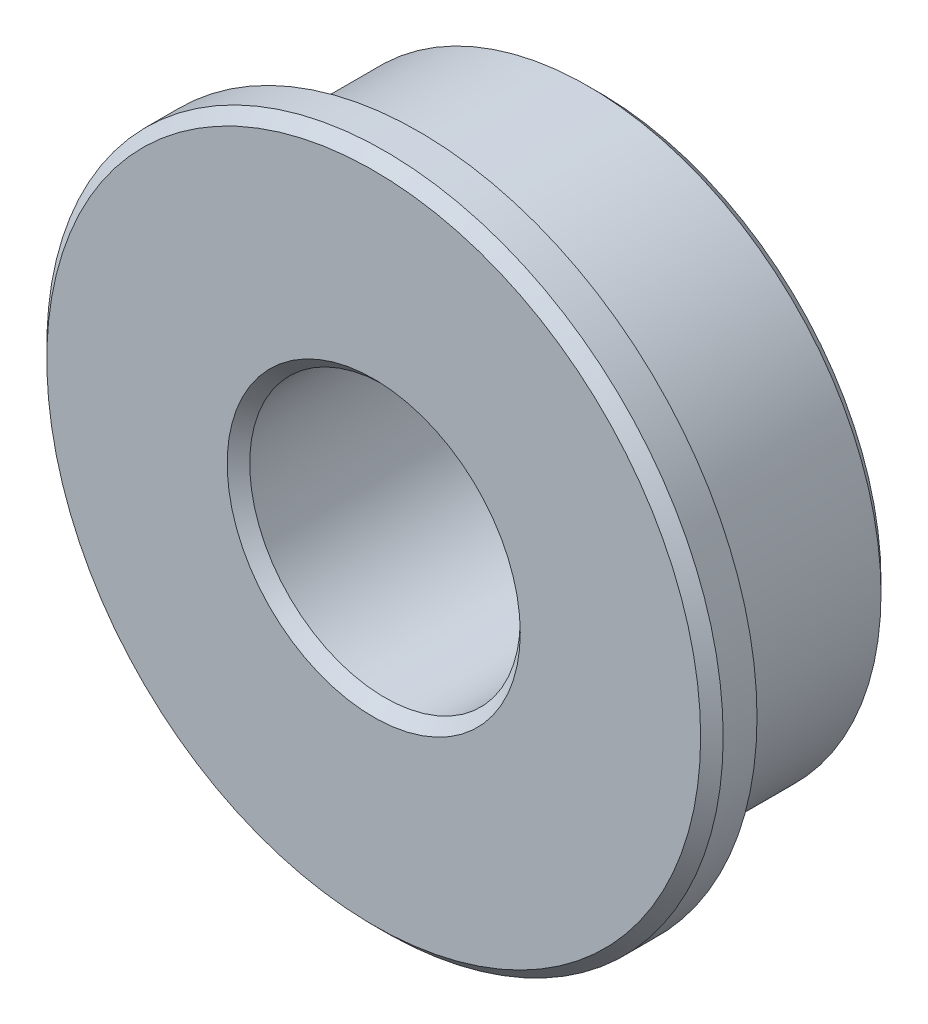
ISO-10303-21;
HEADER;
FILE_DESCRIPTION(('STEP AP214'),'2;1');
FILE_NAME('part.step','',(''),(''),'','','');
FILE_SCHEMA(('AUTOMOTIVE_DESIGN { 1 0 10303 214 1 1 1 1 }'));
ENDSEC;
DATA;
#1=APPLICATION_CONTEXT('core data for automotive mechanical design processes');
#2=APPLICATION_PROTOCOL_DEFINITION('international standard','automotive_design',2000,#1);
#3=PRODUCT_CONTEXT('',#1,'mechanical');
#4=PRODUCT('Part','Part','',(#3));
#5=PRODUCT_RELATED_PRODUCT_CATEGORY('part','',(#4));
#6=PRODUCT_DEFINITION_FORMATION('','',#4);
#7=PRODUCT_DEFINITION_CONTEXT('part definition',#1,'design');
#8=PRODUCT_DEFINITION('design','',#6,#7);
#9=PRODUCT_DEFINITION_SHAPE('','',#8);
#10=(LENGTH_UNIT() NAMED_UNIT(*) SI_UNIT(.MILLI.,.METRE.));
#11=(NAMED_UNIT(*) PLANE_ANGLE_UNIT() SI_UNIT($,.RADIAN.));
#12=(NAMED_UNIT(*) SI_UNIT($,.STERADIAN.) SOLID_ANGLE_UNIT());
#13=UNCERTAINTY_MEASURE_WITH_UNIT(LENGTH_MEASURE(1.E-05),#10,'distance_accuracy_value','');
#14=(GEOMETRIC_REPRESENTATION_CONTEXT(3) GLOBAL_UNCERTAINTY_ASSIGNED_CONTEXT((#13)) GLOBAL_UNIT_ASSIGNED_CONTEXT((#10,
#11,#12)) REPRESENTATION_CONTEXT('',''));
#15=CARTESIAN_POINT('',(0.,0.,0.));
#16=DIRECTION('',(0.,0.,1.));
#17=DIRECTION('',(1.,0.,0.));
#18=AXIS2_PLACEMENT_3D('',#15,#16,#17);
#19=CARTESIAN_POINT('',(0.,0.,5.));
#20=DIRECTION('',(0.,0.,-1.));
#21=DIRECTION('',(-1.,0.,0.));
#22=AXIS2_PLACEMENT_3D('',#19,#20,#21);
#23=CYLINDRICAL_SURFACE('',#22,6.5);
#24=CARTESIAN_POINT('',(0.,0.,0.250000000000003));
#25=DIRECTION('',(0.,0.,1.));
#26=DIRECTION('',(1.,0.,0.));
#27=AXIS2_PLACEMENT_3D('',#24,#25,#26);
#28=CIRCLE('',#27,6.5);
#29=CARTESIAN_POINT('',(6.5,0.,0.250000000000003));
#30=VERTEX_POINT('',#29);
#31=EDGE_CURVE('E38',#30,#30,#28,.T.);
#32=ORIENTED_EDGE('',*,*,#31,.T.);
#33=EDGE_LOOP('',(#32));
#34=FACE_BOUND('',#33,.T.);
#35=CARTESIAN_POINT('',(0.,0.,4.));
#36=DIRECTION('',(0.,0.,1.));
#37=DIRECTION('',(1.,0.,0.));
#38=AXIS2_PLACEMENT_3D('',#35,#36,#37);
#39=CIRCLE('',#38,6.5);
#40=CARTESIAN_POINT('',(6.5,0.,4.));
#41=VERTEX_POINT('',#40);
#42=EDGE_CURVE('E57',#41,#41,#39,.T.);
#43=ORIENTED_EDGE('',*,*,#42,.F.);
#44=EDGE_LOOP('',(#43));
#45=FACE_BOUND('',#44,.T.);
#46=ADVANCED_FACE('F31',(#34,#45),#23,.T.);
#47=CARTESIAN_POINT('',(0.,0.,5.));
#48=DIRECTION('',(0.,0.,1.));
#49=DIRECTION('',(1.,0.,0.));
#50=AXIS2_PLACEMENT_3D('',#47,#48,#49);
#51=PLANE('',#50);
#52=CARTESIAN_POINT('',(0.,0.,5.));
#53=DIRECTION('',(0.,0.,1.));
#54=DIRECTION('',(1.,0.,0.));
#55=AXIS2_PLACEMENT_3D('',#52,#53,#54);
#56=CIRCLE('',#55,7.25);
#57=CARTESIAN_POINT('',(7.25,0.,5.));
#58=VERTEX_POINT('',#57);
#59=EDGE_CURVE('E51',#58,#58,#56,.T.);
#60=ORIENTED_EDGE('',*,*,#59,.T.);
#61=EDGE_LOOP('',(#60));
#62=FACE_BOUND('',#61,.T.);
#63=CARTESIAN_POINT('',(0.,0.,5.));
#64=DIRECTION('',(0.,0.,1.));
#65=DIRECTION('',(1.,0.,0.));
#66=AXIS2_PLACEMENT_3D('',#63,#64,#65);
#67=CIRCLE('',#66,3.25);
#68=CARTESIAN_POINT('',(3.25,0.,5.));
#69=VERTEX_POINT('',#68);
#70=EDGE_CURVE('E54',#69,#69,#67,.F.);
#71=ORIENTED_EDGE('',*,*,#70,.T.);
#72=EDGE_LOOP('',(#71));
#73=FACE_BOUND('',#72,.T.);
#74=ADVANCED_FACE('F77',(#62,#73),#51,.T.);
#75=CARTESIAN_POINT('',(0.,0.,0.));
#76=DIRECTION('',(0.,0.,1.));
#77=DIRECTION('',(1.,0.,0.));
#78=AXIS2_PLACEMENT_3D('',#75,#76,#77);
#79=PLANE('',#78);
#80=CARTESIAN_POINT('',(0.,0.,0.));
#81=DIRECTION('',(0.,0.,1.));
#82=DIRECTION('',(1.,0.,0.));
#83=AXIS2_PLACEMENT_3D('',#80,#81,#82);
#84=CIRCLE('',#83,6.25);
#85=CARTESIAN_POINT('',(6.25,0.,0.));
#86=VERTEX_POINT('',#85);
#87=EDGE_CURVE('E10',#86,#86,#84,.F.);
#88=ORIENTED_EDGE('',*,*,#87,.T.);
#89=EDGE_LOOP('',(#88));
#90=FACE_BOUND('',#89,.T.);
#91=CARTESIAN_POINT('',(0.,0.,0.));
#92=DIRECTION('',(0.,0.,1.));
#93=DIRECTION('',(1.,0.,0.));
#94=AXIS2_PLACEMENT_3D('',#91,#92,#93);
#95=CIRCLE('',#94,3.);
#96=CARTESIAN_POINT('',(3.,0.,0.));
#97=VERTEX_POINT('',#96);
#98=EDGE_CURVE('E58',#97,#97,#95,.T.);
#99=ORIENTED_EDGE('',*,*,#98,.T.);
#100=EDGE_LOOP('',(#99));
#101=FACE_BOUND('',#100,.T.);
#102=ADVANCED_FACE('F83',(#90,#101),#79,.F.);
#103=CARTESIAN_POINT('',(0.,0.,5.));
#104=DIRECTION('',(0.,0.,-1.));
#105=DIRECTION('',(-1.,0.,0.));
#106=AXIS2_PLACEMENT_3D('',#103,#104,#105);
#107=CYLINDRICAL_SURFACE('',#106,3.);
#108=CARTESIAN_POINT('',(0.,0.,4.75));
#109=DIRECTION('',(0.,0.,1.));
#110=DIRECTION('',(1.,0.,0.));
#111=AXIS2_PLACEMENT_3D('',#108,#109,#110);
#112=CIRCLE('',#111,3.);
#113=CARTESIAN_POINT('',(3.,0.,4.75));
#114=VERTEX_POINT('',#113);
#115=EDGE_CURVE('E42',#114,#114,#112,.T.);
#116=ORIENTED_EDGE('',*,*,#115,.T.);
#117=EDGE_LOOP('',(#116));
#118=FACE_BOUND('',#117,.T.);
#119=ORIENTED_EDGE('',*,*,#98,.F.);
#120=EDGE_LOOP('',(#119));
#121=FACE_BOUND('',#120,.T.);
#122=ADVANCED_FACE('F72',(#118,#121),#107,.F.);
#123=CARTESIAN_POINT('',(0.,0.,4.));
#124=DIRECTION('',(0.,0.,1.));
#125=DIRECTION('',(1.,0.,0.));
#126=AXIS2_PLACEMENT_3D('',#123,#124,#125);
#127=PLANE('',#126);
#128=CARTESIAN_POINT('',(0.,0.,4.));
#129=DIRECTION('',(0.,0.,1.));
#130=DIRECTION('',(1.,0.,0.));
#131=AXIS2_PLACEMENT_3D('',#128,#129,#130);
#132=CIRCLE('',#131,7.5);
#133=CARTESIAN_POINT('',(7.5,0.,4.));
#134=VERTEX_POINT('',#133);
#135=EDGE_CURVE('E61',#134,#134,#132,.T.);
#136=ORIENTED_EDGE('',*,*,#135,.F.);
#137=EDGE_LOOP('',(#136));
#138=FACE_BOUND('',#137,.T.);
#139=ORIENTED_EDGE('',*,*,#42,.T.);
#140=EDGE_LOOP('',(#139));
#141=FACE_BOUND('',#140,.T.);
#142=ADVANCED_FACE('F69',(#138,#141),#127,.F.);
#143=CARTESIAN_POINT('',(0.,0.,4.));
#144=DIRECTION('',(0.,0.,1.));
#145=DIRECTION('',(1.,0.,0.));
#146=AXIS2_PLACEMENT_3D('',#143,#144,#145);
#147=CYLINDRICAL_SURFACE('',#146,7.5);
#148=CARTESIAN_POINT('',(0.,0.,4.75));
#149=DIRECTION('',(0.,0.,1.));
#150=DIRECTION('',(1.,0.,0.));
#151=AXIS2_PLACEMENT_3D('',#148,#149,#150);
#152=CIRCLE('',#151,7.5);
#153=CARTESIAN_POINT('',(7.5,0.,4.75));
#154=VERTEX_POINT('',#153);
#155=EDGE_CURVE('E46',#154,#154,#152,.F.);
#156=ORIENTED_EDGE('',*,*,#155,.T.);
#157=EDGE_LOOP('',(#156));
#158=FACE_BOUND('',#157,.T.);
#159=ORIENTED_EDGE('',*,*,#135,.T.);
#160=EDGE_LOOP('',(#159));
#161=FACE_BOUND('',#160,.T.);
#162=ADVANCED_FACE('F67',(#158,#161),#147,.T.);
#163=CARTESIAN_POINT('',(0.,0.,5.));
#164=DIRECTION('',(0.,0.,-1.));
#165=DIRECTION('',(-1.,0.,0.));
#166=AXIS2_PLACEMENT_3D('',#163,#164,#165);
#167=CONICAL_SURFACE('',#166,7.25,0.785398163397447);
#168=ORIENTED_EDGE('',*,*,#155,.F.);
#169=EDGE_LOOP('',(#168));
#170=FACE_BOUND('',#169,.T.);
#171=ORIENTED_EDGE('',*,*,#59,.F.);
#172=EDGE_LOOP('',(#171));
#173=FACE_BOUND('',#172,.T.);
#174=ADVANCED_FACE('F88',(#170,#173),#167,.T.);
#175=CARTESIAN_POINT('',(0.,0.,4.75));
#176=DIRECTION('',(0.,0.,1.));
#177=DIRECTION('',(1.,0.,0.));
#178=AXIS2_PLACEMENT_3D('',#175,#176,#177);
#179=CONICAL_SURFACE('',#178,3.,0.785398163397448);
#180=ORIENTED_EDGE('',*,*,#70,.F.);
#181=EDGE_LOOP('',(#180));
#182=FACE_BOUND('',#181,.T.);
#183=ORIENTED_EDGE('',*,*,#115,.F.);
#184=EDGE_LOOP('',(#183));
#185=FACE_BOUND('',#184,.T.);
#186=ADVANCED_FACE('F90',(#182,#185),#179,.F.);
#187=CARTESIAN_POINT('',(0.,0.,0.250000000000003));
#188=DIRECTION('',(0.,0.,1.));
#189=DIRECTION('',(1.,0.,0.));
#190=AXIS2_PLACEMENT_3D('',#187,#188,#189);
#191=CONICAL_SURFACE('',#190,6.5,0.78539816339745);
#192=ORIENTED_EDGE('',*,*,#87,.F.);
#193=EDGE_LOOP('',(#192));
#194=FACE_BOUND('',#193,.T.);
#195=ORIENTED_EDGE('',*,*,#31,.F.);
#196=EDGE_LOOP('',(#195));
#197=FACE_BOUND('',#196,.T.);
#198=ADVANCED_FACE('F33',(#194,#197),#191,.T.);
#199=CLOSED_SHELL('',(#46,#74,#102,#122,#142,#162,#174,#186,#198));
#200=MANIFOLD_SOLID_BREP('B2',#199);
#201=ADVANCED_BREP_SHAPE_REPRESENTATION('',(#18,#200),#14);
#202=SHAPE_DEFINITION_REPRESENTATION(#9,#201);
ENDSEC;
END-ISO-10303-21;
